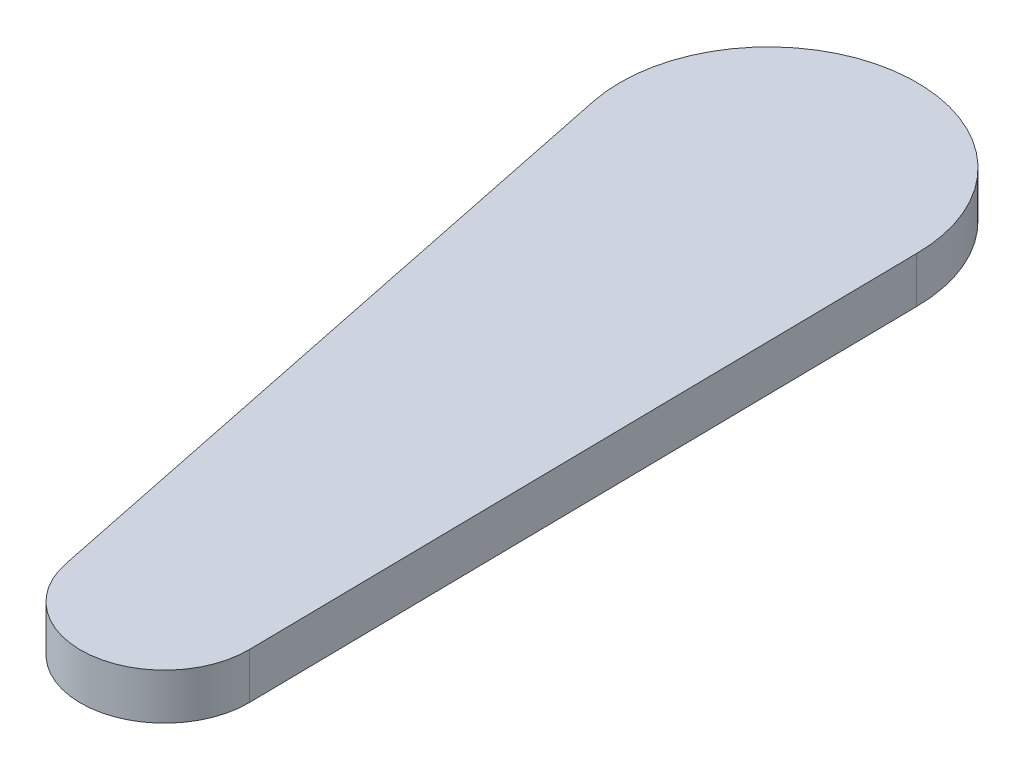
ISO-10303-21;
HEADER;
FILE_DESCRIPTION(('STEP AP214'),'2;1');
FILE_NAME('part.step','',(''),(''),'','','');
FILE_SCHEMA(('AUTOMOTIVE_DESIGN { 1 0 10303 214 1 1 1 1 }'));
ENDSEC;
DATA;
#1=APPLICATION_CONTEXT('core data for automotive mechanical design processes');
#2=APPLICATION_PROTOCOL_DEFINITION('international standard','automotive_design',2000,#1);
#3=PRODUCT_CONTEXT('',#1,'mechanical');
#4=PRODUCT('Part','Part','',(#3));
#5=PRODUCT_RELATED_PRODUCT_CATEGORY('part','',(#4));
#6=PRODUCT_DEFINITION_FORMATION('','',#4);
#7=PRODUCT_DEFINITION_CONTEXT('part definition',#1,'design');
#8=PRODUCT_DEFINITION('design','',#6,#7);
#9=PRODUCT_DEFINITION_SHAPE('','',#8);
#10=(LENGTH_UNIT() NAMED_UNIT(*) SI_UNIT(.MILLI.,.METRE.));
#11=(NAMED_UNIT(*) PLANE_ANGLE_UNIT() SI_UNIT($,.RADIAN.));
#12=(NAMED_UNIT(*) SI_UNIT($,.STERADIAN.) SOLID_ANGLE_UNIT());
#13=UNCERTAINTY_MEASURE_WITH_UNIT(LENGTH_MEASURE(1.E-05),#10,'distance_accuracy_value','');
#14=(GEOMETRIC_REPRESENTATION_CONTEXT(3) GLOBAL_UNCERTAINTY_ASSIGNED_CONTEXT((#13)) GLOBAL_UNIT_ASSIGNED_CONTEXT((#10,
#11,#12)) REPRESENTATION_CONTEXT('',''));
#15=CARTESIAN_POINT('',(0.,0.,0.));
#16=DIRECTION('',(0.,0.,1.));
#17=DIRECTION('',(1.,0.,0.));
#18=AXIS2_PLACEMENT_3D('',#15,#16,#17);
#19=CARTESIAN_POINT('',(235.534075642621,392.892270620004,-1577.93605811411));
#20=DIRECTION('',(0.,-1.,0.));
#21=DIRECTION('',(1.,0.,0.));
#22=AXIS2_PLACEMENT_3D('',#19,#20,#21);
#23=CYLINDRICAL_SURFACE('',#22,3.64999999999995);
#24=CARTESIAN_POINT('',(235.534075642621,390.892270620004,-1577.93605811411));
#25=DIRECTION('',(0.,1.,0.));
#26=DIRECTION('',(-1.,0.,0.));
#27=AXIS2_PLACEMENT_3D('',#24,#25,#26);
#28=CIRCLE('',#27,3.64999999999995);
#29=CARTESIAN_POINT('',(231.95892542966,390.892270620004,-1577.20066641252));
#30=VERTEX_POINT('',#29);
#31=CARTESIAN_POINT('',(239.183723612852,390.892270620004,-1577.98675025738));
#32=VERTEX_POINT('',#31);
#33=EDGE_CURVE('E116',#30,#32,#28,.T.);
#34=ORIENTED_EDGE('',*,*,#33,.T.);
#35=DIRECTION('',(0.,-1.,0.));
#36=VECTOR('',#35,1.);
#37=CARTESIAN_POINT('',(239.183723612852,392.892270620004,-1577.98675025738));
#38=LINE('',#37,#36);
#39=CARTESIAN_POINT('',(239.183723612852,392.892270620004,-1577.98675025738));
#40=VERTEX_POINT('',#39);
#41=EDGE_CURVE('E11',#40,#32,#38,.T.);
#42=ORIENTED_EDGE('',*,*,#41,.F.);
#43=CARTESIAN_POINT('',(235.534075642621,392.892270620004,-1577.93605811411));
#44=DIRECTION('',(0.,1.,0.));
#45=DIRECTION('',(-1.,0.,0.));
#46=AXIS2_PLACEMENT_3D('',#43,#44,#45);
#47=CIRCLE('',#46,3.64999999999995);
#48=CARTESIAN_POINT('',(231.95892542966,392.892270620004,-1577.20066641252));
#49=VERTEX_POINT('',#48);
#50=EDGE_CURVE('E98',#49,#40,#47,.T.);
#51=ORIENTED_EDGE('',*,*,#50,.F.);
#52=DIRECTION('',(0.,-1.,0.));
#53=VECTOR('',#52,1.);
#54=CARTESIAN_POINT('',(231.95892542966,392.892270620004,-1577.20066641252));
#55=LINE('',#54,#53);
#56=EDGE_CURVE('E112',#49,#30,#55,.T.);
#57=ORIENTED_EDGE('',*,*,#56,.T.);
#58=EDGE_LOOP('',(#34,#42,#51,#57));
#59=FACE_BOUND('',#58,.T.);
#60=ADVANCED_FACE('F41',(#59),#23,.T.);
#61=CARTESIAN_POINT('',(239.183723612852,392.892270620004,-1577.98675025738));
#62=DIRECTION('',(-0.999903553487923,0.,0.0138882584301972));
#63=DIRECTION('',(0.0138882584301972,0.,0.999903553487923));
#64=AXIS2_PLACEMENT_3D('',#61,#62,#63);
#65=PLANE('',#64);
#66=DIRECTION('',(-0.0138882584301972,0.,-0.999903553487923));
#67=VECTOR('',#66,1.);
#68=CARTESIAN_POINT('',(239.183723612852,390.892270620004,-1577.98675025738));
#69=LINE('',#68,#67);
#70=CARTESIAN_POINT('',(238.774684564357,390.892270620004,-1607.43605811412));
#71=VERTEX_POINT('',#70);
#72=EDGE_CURVE('E103',#32,#71,#69,.T.);
#73=ORIENTED_EDGE('',*,*,#72,.T.);
#74=DIRECTION('',(0.,-1.,0.));
#75=VECTOR('',#74,1.);
#76=CARTESIAN_POINT('',(238.774684564357,392.892270620004,-1607.43605811412));
#77=LINE('',#76,#75);
#78=CARTESIAN_POINT('',(238.774684564357,392.892270620004,-1607.43605811412));
#79=VERTEX_POINT('',#78);
#80=EDGE_CURVE('E49',#79,#71,#77,.T.);
#81=ORIENTED_EDGE('',*,*,#80,.F.);
#82=DIRECTION('',(-0.0138882584301972,0.,-0.999903553487923));
#83=VECTOR('',#82,1.);
#84=CARTESIAN_POINT('',(239.183723612852,392.892270620004,-1577.98675025738));
#85=LINE('',#84,#83);
#86=EDGE_CURVE('E93',#40,#79,#85,.T.);
#87=ORIENTED_EDGE('',*,*,#86,.F.);
#88=ORIENTED_EDGE('',*,*,#41,.T.);
#89=EDGE_LOOP('',(#73,#81,#87,#88));
#90=FACE_BOUND('',#89,.T.);
#91=ADVANCED_FACE('F102',(#90),#65,.F.);
#92=CARTESIAN_POINT('',(232.324684564357,392.892270620004,-1607.43605811412));
#93=DIRECTION('',(0.,-1.,0.));
#94=DIRECTION('',(1.,0.,0.));
#95=AXIS2_PLACEMENT_3D('',#92,#93,#94);
#96=CYLINDRICAL_SURFACE('',#95,6.44999999999999);
#97=CARTESIAN_POINT('',(232.324684564357,390.892270620004,-1607.43605811412));
#98=DIRECTION('',(0.,1.,0.));
#99=DIRECTION('',(-1.,0.,0.));
#100=AXIS2_PLACEMENT_3D('',#97,#98,#99);
#101=CIRCLE('',#100,6.44999999999999);
#102=CARTESIAN_POINT('',(226.006953366112,390.892270620004,-1606.13653031268));
#103=VERTEX_POINT('',#102);
#104=EDGE_CURVE('E80',#71,#103,#101,.T.);
#105=ORIENTED_EDGE('',*,*,#104,.T.);
#106=DIRECTION('',(0.,-1.,0.));
#107=VECTOR('',#106,1.);
#108=CARTESIAN_POINT('',(226.006953366112,392.892270620004,-1606.13653031268));
#109=LINE('',#108,#107);
#110=CARTESIAN_POINT('',(226.006953366112,392.892270620004,-1606.13653031268));
#111=VERTEX_POINT('',#110);
#112=EDGE_CURVE('E105',#111,#103,#109,.T.);
#113=ORIENTED_EDGE('',*,*,#112,.F.);
#114=CARTESIAN_POINT('',(232.324684564357,392.892270620004,-1607.43605811412));
#115=DIRECTION('',(0.,1.,0.));
#116=DIRECTION('',(-1.,0.,0.));
#117=AXIS2_PLACEMENT_3D('',#114,#115,#116);
#118=CIRCLE('',#117,6.44999999999999);
#119=EDGE_CURVE('E96',#79,#111,#118,.T.);
#120=ORIENTED_EDGE('',*,*,#119,.F.);
#121=ORIENTED_EDGE('',*,*,#80,.T.);
#122=EDGE_LOOP('',(#105,#113,#120,#121));
#123=FACE_BOUND('',#122,.T.);
#124=ADVANCED_FACE('F106',(#123),#96,.T.);
#125=CARTESIAN_POINT('',(226.006953366112,392.892270620004,-1606.13653031268));
#126=DIRECTION('',(0.979493209030286,0.,-0.201477178517947));
#127=DIRECTION('',(-0.201477178517947,0.,-0.979493209030286));
#128=AXIS2_PLACEMENT_3D('',#125,#126,#127);
#129=PLANE('',#128);
#130=DIRECTION('',(0.201477178517947,0.,0.979493209030286));
#131=VECTOR('',#130,1.);
#132=CARTESIAN_POINT('',(226.006953366112,390.892270620004,-1606.13653031268));
#133=LINE('',#132,#131);
#134=EDGE_CURVE('E86',#103,#30,#133,.T.);
#135=ORIENTED_EDGE('',*,*,#134,.T.);
#136=ORIENTED_EDGE('',*,*,#56,.F.);
#137=DIRECTION('',(0.201477178517947,0.,0.979493209030286));
#138=VECTOR('',#137,1.);
#139=CARTESIAN_POINT('',(226.006953366112,392.892270620004,-1606.13653031268));
#140=LINE('',#139,#138);
#141=EDGE_CURVE('E59',#111,#49,#140,.T.);
#142=ORIENTED_EDGE('',*,*,#141,.F.);
#143=ORIENTED_EDGE('',*,*,#112,.T.);
#144=EDGE_LOOP('',(#135,#136,#142,#143));
#145=FACE_BOUND('',#144,.T.);
#146=ADVANCED_FACE('F127',(#145),#129,.F.);
#147=CARTESIAN_POINT('',(235.534075642621,392.892270620004,-1577.93605811411));
#148=DIRECTION('',(0.,1.,0.));
#149=DIRECTION('',(-1.,0.,0.));
#150=AXIS2_PLACEMENT_3D('',#147,#148,#149);
#151=PLANE('',#150);
#152=ORIENTED_EDGE('',*,*,#50,.T.);
#153=ORIENTED_EDGE('',*,*,#86,.T.);
#154=ORIENTED_EDGE('',*,*,#119,.T.);
#155=ORIENTED_EDGE('',*,*,#141,.T.);
#156=EDGE_LOOP('',(#152,#153,#154,#155));
#157=FACE_BOUND('',#156,.T.);
#158=ADVANCED_FACE('F94',(#157),#151,.T.);
#159=CARTESIAN_POINT('',(235.534075642621,390.892270620004,-1577.93605811411));
#160=DIRECTION('',(0.,1.,0.));
#161=DIRECTION('',(-1.,0.,0.));
#162=AXIS2_PLACEMENT_3D('',#159,#160,#161);
#163=PLANE('',#162);
#164=ORIENTED_EDGE('',*,*,#33,.F.);
#165=ORIENTED_EDGE('',*,*,#134,.F.);
#166=ORIENTED_EDGE('',*,*,#104,.F.);
#167=ORIENTED_EDGE('',*,*,#72,.F.);
#168=EDGE_LOOP('',(#164,#165,#166,#167));
#169=FACE_BOUND('',#168,.T.);
#170=ADVANCED_FACE('F130',(#169),#163,.F.);
#171=CLOSED_SHELL('',(#60,#91,#124,#146,#158,#170));
#172=MANIFOLD_SOLID_BREP('B2',#171);
#173=ADVANCED_BREP_SHAPE_REPRESENTATION('',(#18,#172),#14);
#174=SHAPE_DEFINITION_REPRESENTATION(#9,#173);
ENDSEC;
END-ISO-10303-21;
